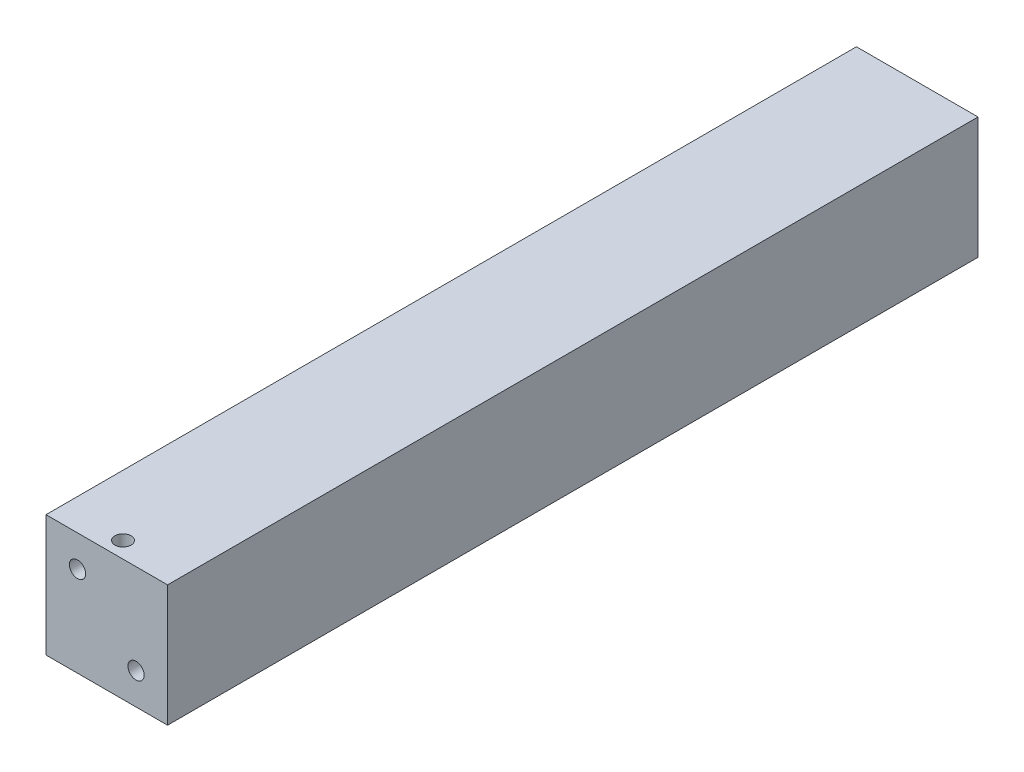
ISO-10303-21;
HEADER;
FILE_DESCRIPTION(('STEP AP214'),'2;1');
FILE_NAME('part.step','',(''),(''),'','','');
FILE_SCHEMA(('AUTOMOTIVE_DESIGN { 1 0 10303 214 1 1 1 1 }'));
ENDSEC;
DATA;
#1=APPLICATION_CONTEXT('core data for automotive mechanical design processes');
#2=APPLICATION_PROTOCOL_DEFINITION('international standard','automotive_design',2000,#1);
#3=PRODUCT_CONTEXT('',#1,'mechanical');
#4=PRODUCT('Part','Part','',(#3));
#5=PRODUCT_RELATED_PRODUCT_CATEGORY('part','',(#4));
#6=PRODUCT_DEFINITION_FORMATION('','',#4);
#7=PRODUCT_DEFINITION_CONTEXT('part definition',#1,'design');
#8=PRODUCT_DEFINITION('design','',#6,#7);
#9=PRODUCT_DEFINITION_SHAPE('','',#8);
#10=(LENGTH_UNIT() NAMED_UNIT(*) SI_UNIT(.MILLI.,.METRE.));
#11=(NAMED_UNIT(*) PLANE_ANGLE_UNIT() SI_UNIT($,.RADIAN.));
#12=(NAMED_UNIT(*) SI_UNIT($,.STERADIAN.) SOLID_ANGLE_UNIT());
#13=UNCERTAINTY_MEASURE_WITH_UNIT(LENGTH_MEASURE(1.E-05),#10,'distance_accuracy_value','');
#14=(GEOMETRIC_REPRESENTATION_CONTEXT(3) GLOBAL_UNCERTAINTY_ASSIGNED_CONTEXT((#13)) GLOBAL_UNIT_ASSIGNED_CONTEXT((#10,
#11,#12)) REPRESENTATION_CONTEXT('',''));
#15=CARTESIAN_POINT('',(0.,0.,0.));
#16=DIRECTION('',(0.,0.,1.));
#17=DIRECTION('',(1.,0.,0.));
#18=AXIS2_PLACEMENT_3D('',#15,#16,#17);
#19=CARTESIAN_POINT('',(15.,-15.,200.));
#20=DIRECTION('',(-1.,0.,0.));
#21=DIRECTION('',(0.,0.,1.));
#22=AXIS2_PLACEMENT_3D('',#19,#20,#21);
#23=PLANE('',#22);
#24=DIRECTION('',(0.,1.,0.));
#25=VECTOR('',#24,1.);
#26=CARTESIAN_POINT('',(15.,-15.,0.));
#27=LINE('',#26,#25);
#28=CARTESIAN_POINT('',(15.,-15.,0.));
#29=VERTEX_POINT('',#28);
#30=CARTESIAN_POINT('',(15.,15.,0.));
#31=VERTEX_POINT('',#30);
#32=EDGE_CURVE('E113',#29,#31,#27,.T.);
#33=ORIENTED_EDGE('',*,*,#32,.T.);
#34=DIRECTION('',(0.,0.,-1.));
#35=VECTOR('',#34,1.);
#36=CARTESIAN_POINT('',(15.,15.,200.));
#37=LINE('',#36,#35);
#38=CARTESIAN_POINT('',(15.,15.,200.));
#39=VERTEX_POINT('',#38);
#40=EDGE_CURVE('E11',#39,#31,#37,.T.);
#41=ORIENTED_EDGE('',*,*,#40,.F.);
#42=DIRECTION('',(0.,1.,0.));
#43=VECTOR('',#42,1.);
#44=CARTESIAN_POINT('',(15.,-15.,200.));
#45=LINE('',#44,#43);
#46=CARTESIAN_POINT('',(15.,-15.,200.));
#47=VERTEX_POINT('',#46);
#48=EDGE_CURVE('E97',#47,#39,#45,.T.);
#49=ORIENTED_EDGE('',*,*,#48,.F.);
#50=DIRECTION('',(0.,0.,-1.));
#51=VECTOR('',#50,1.);
#52=CARTESIAN_POINT('',(15.,-15.,200.));
#53=LINE('',#52,#51);
#54=EDGE_CURVE('E109',#47,#29,#53,.T.);
#55=ORIENTED_EDGE('',*,*,#54,.T.);
#56=EDGE_LOOP('',(#33,#41,#49,#55));
#57=FACE_BOUND('',#56,.T.);
#58=ADVANCED_FACE('F45',(#57),#23,.F.);
#59=CARTESIAN_POINT('',(-15.,15.,200.));
#60=DIRECTION('',(0.,-1.,0.));
#61=DIRECTION('',(0.,0.,-1.));
#62=AXIS2_PLACEMENT_3D('',#59,#60,#61);
#63=PLANE('',#62);
#64=CARTESIAN_POINT('',(0.,15.,196.));
#65=DIRECTION('',(0.,1.,0.));
#66=DIRECTION('',(0.,0.,1.));
#67=AXIS2_PLACEMENT_3D('',#64,#65,#66);
#68=CIRCLE('',#67,2.);
#69=CARTESIAN_POINT('',(0.,15.,198.));
#70=VERTEX_POINT('',#69);
#71=EDGE_CURVE('E150',#70,#70,#68,.T.);
#72=ORIENTED_EDGE('',*,*,#71,.F.);
#73=EDGE_LOOP('',(#72));
#74=FACE_BOUND('',#73,.T.);
#75=DIRECTION('',(-1.,0.,0.));
#76=VECTOR('',#75,1.);
#77=CARTESIAN_POINT('',(-15.,15.,0.));
#78=LINE('',#77,#76);
#79=CARTESIAN_POINT('',(-15.,15.,0.));
#80=VERTEX_POINT('',#79);
#81=EDGE_CURVE('E102',#31,#80,#78,.T.);
#82=ORIENTED_EDGE('',*,*,#81,.T.);
#83=DIRECTION('',(0.,0.,-1.));
#84=VECTOR('',#83,1.);
#85=CARTESIAN_POINT('',(-15.,15.,200.));
#86=LINE('',#85,#84);
#87=CARTESIAN_POINT('',(-15.,15.,200.));
#88=VERTEX_POINT('',#87);
#89=EDGE_CURVE('E54',#88,#80,#86,.T.);
#90=ORIENTED_EDGE('',*,*,#89,.F.);
#91=DIRECTION('',(-1.,0.,0.));
#92=VECTOR('',#91,1.);
#93=CARTESIAN_POINT('',(-15.,15.,200.));
#94=LINE('',#93,#92);
#95=EDGE_CURVE('E92',#39,#88,#94,.T.);
#96=ORIENTED_EDGE('',*,*,#95,.F.);
#97=ORIENTED_EDGE('',*,*,#40,.T.);
#98=EDGE_LOOP('',(#82,#90,#96,#97));
#99=FACE_BOUND('',#98,.T.);
#100=ADVANCED_FACE('F101',(#74,#99),#63,.F.);
#101=CARTESIAN_POINT('',(-15.,-15.,200.));
#102=DIRECTION('',(1.,0.,0.));
#103=DIRECTION('',(0.,0.,-1.));
#104=AXIS2_PLACEMENT_3D('',#101,#102,#103);
#105=PLANE('',#104);
#106=DIRECTION('',(0.,-1.,0.));
#107=VECTOR('',#106,1.);
#108=CARTESIAN_POINT('',(-15.,-15.,0.));
#109=LINE('',#108,#107);
#110=CARTESIAN_POINT('',(-15.,-15.,0.));
#111=VERTEX_POINT('',#110);
#112=EDGE_CURVE('E79',#80,#111,#109,.T.);
#113=ORIENTED_EDGE('',*,*,#112,.T.);
#114=DIRECTION('',(0.,0.,-1.));
#115=VECTOR('',#114,1.);
#116=CARTESIAN_POINT('',(-15.,-15.,200.));
#117=LINE('',#116,#115);
#118=CARTESIAN_POINT('',(-15.,-15.,200.));
#119=VERTEX_POINT('',#118);
#120=EDGE_CURVE('E104',#119,#111,#117,.T.);
#121=ORIENTED_EDGE('',*,*,#120,.F.);
#122=DIRECTION('',(0.,-1.,0.));
#123=VECTOR('',#122,1.);
#124=CARTESIAN_POINT('',(-15.,-15.,200.));
#125=LINE('',#124,#123);
#126=EDGE_CURVE('E95',#88,#119,#125,.T.);
#127=ORIENTED_EDGE('',*,*,#126,.F.);
#128=ORIENTED_EDGE('',*,*,#89,.T.);
#129=EDGE_LOOP('',(#113,#121,#127,#128));
#130=FACE_BOUND('',#129,.T.);
#131=ADVANCED_FACE('F105',(#130),#105,.F.);
#132=CARTESIAN_POINT('',(-15.,-15.,200.));
#133=DIRECTION('',(0.,1.,0.));
#134=DIRECTION('',(0.,0.,1.));
#135=AXIS2_PLACEMENT_3D('',#132,#133,#134);
#136=PLANE('',#135);
#137=CARTESIAN_POINT('',(0.,-15.,196.));
#138=DIRECTION('',(0.,1.,0.));
#139=DIRECTION('',(0.,0.,1.));
#140=AXIS2_PLACEMENT_3D('',#137,#138,#139);
#141=CIRCLE('',#140,2.);
#142=CARTESIAN_POINT('',(0.,-15.,198.));
#143=VERTEX_POINT('',#142);
#144=EDGE_CURVE('E139',#143,#143,#141,.T.);
#145=ORIENTED_EDGE('',*,*,#144,.T.);
#146=EDGE_LOOP('',(#145));
#147=FACE_BOUND('',#146,.T.);
#148=DIRECTION('',(1.,0.,0.));
#149=VECTOR('',#148,1.);
#150=CARTESIAN_POINT('',(-15.,-15.,0.));
#151=LINE('',#150,#149);
#152=EDGE_CURVE('E85',#111,#29,#151,.T.);
#153=ORIENTED_EDGE('',*,*,#152,.T.);
#154=ORIENTED_EDGE('',*,*,#54,.F.);
#155=DIRECTION('',(1.,0.,0.));
#156=VECTOR('',#155,1.);
#157=CARTESIAN_POINT('',(-15.,-15.,200.));
#158=LINE('',#157,#156);
#159=EDGE_CURVE('E62',#119,#47,#158,.T.);
#160=ORIENTED_EDGE('',*,*,#159,.F.);
#161=ORIENTED_EDGE('',*,*,#120,.T.);
#162=EDGE_LOOP('',(#153,#154,#160,#161));
#163=FACE_BOUND('',#162,.T.);
#164=ADVANCED_FACE('F127',(#147,#163),#136,.F.);
#165=CARTESIAN_POINT('',(0.,0.,200.));
#166=DIRECTION('',(0.,0.,-1.));
#167=DIRECTION('',(-1.,0.,0.));
#168=AXIS2_PLACEMENT_3D('',#165,#166,#167);
#169=PLANE('',#168);
#170=CARTESIAN_POINT('',(-7.22182540694798,7.22182540694798,200.));
#171=DIRECTION('',(0.,0.,1.));
#172=DIRECTION('',(1.,0.,0.));
#173=AXIS2_PLACEMENT_3D('',#170,#171,#172);
#174=CIRCLE('',#173,2.);
#175=CARTESIAN_POINT('',(-5.22182540694798,7.22182540694798,200.));
#176=VERTEX_POINT('',#175);
#177=EDGE_CURVE('E143',#176,#176,#174,.T.);
#178=ORIENTED_EDGE('',*,*,#177,.F.);
#179=EDGE_LOOP('',(#178));
#180=FACE_BOUND('',#179,.T.);
#181=CARTESIAN_POINT('',(7.22182540694797,-7.22182540694799,200.));
#182=DIRECTION('',(0.,0.,1.));
#183=DIRECTION('',(-1.,0.,0.));
#184=AXIS2_PLACEMENT_3D('',#181,#182,#183);
#185=CIRCLE('',#184,2.00000000000001);
#186=CARTESIAN_POINT('',(5.22182540694796,-7.22182540694799,200.));
#187=VERTEX_POINT('',#186);
#188=EDGE_CURVE('E138',#187,#187,#185,.T.);
#189=ORIENTED_EDGE('',*,*,#188,.F.);
#190=EDGE_LOOP('',(#189));
#191=FACE_BOUND('',#190,.T.);
#192=ORIENTED_EDGE('',*,*,#48,.T.);
#193=ORIENTED_EDGE('',*,*,#95,.T.);
#194=ORIENTED_EDGE('',*,*,#126,.T.);
#195=ORIENTED_EDGE('',*,*,#159,.T.);
#196=EDGE_LOOP('',(#192,#193,#194,#195));
#197=FACE_BOUND('',#196,.T.);
#198=ADVANCED_FACE('F93',(#180,#191,#197),#169,.F.);
#199=CARTESIAN_POINT('',(0.,0.,0.));
#200=DIRECTION('',(0.,0.,-1.));
#201=DIRECTION('',(-1.,0.,0.));
#202=AXIS2_PLACEMENT_3D('',#199,#200,#201);
#203=PLANE('',#202);
#204=CARTESIAN_POINT('',(0.,0.,0.));
#205=DIRECTION('',(0.,0.,-1.));
#206=DIRECTION('',(-1.,0.,0.));
#207=AXIS2_PLACEMENT_3D('',#204,#205,#206);
#208=CIRCLE('',#207,2.);
#209=CARTESIAN_POINT('',(-2.,0.,0.));
#210=VERTEX_POINT('',#209);
#211=EDGE_CURVE('E158',#210,#210,#208,.T.);
#212=ORIENTED_EDGE('',*,*,#211,.F.);
#213=EDGE_LOOP('',(#212));
#214=FACE_BOUND('',#213,.T.);
#215=ORIENTED_EDGE('',*,*,#32,.F.);
#216=ORIENTED_EDGE('',*,*,#152,.F.);
#217=ORIENTED_EDGE('',*,*,#112,.F.);
#218=ORIENTED_EDGE('',*,*,#81,.F.);
#219=EDGE_LOOP('',(#215,#216,#217,#218));
#220=FACE_BOUND('',#219,.T.);
#221=ADVANCED_FACE('F130',(#214,#220),#203,.T.);
#222=CARTESIAN_POINT('',(7.22182540694797,-7.22182540694799,175.));
#223=DIRECTION('',(0.,0.,1.));
#224=DIRECTION('',(1.,0.,0.));
#225=AXIS2_PLACEMENT_3D('',#222,#223,#224);
#226=CYLINDRICAL_SURFACE('',#225,2.00000000000001);
#227=CARTESIAN_POINT('',(7.22182540694797,-7.22182540694799,175.));
#228=DIRECTION('',(0.,0.,1.));
#229=DIRECTION('',(-1.,0.,0.));
#230=AXIS2_PLACEMENT_3D('',#227,#228,#229);
#231=CIRCLE('',#230,2.00000000000001);
#232=CARTESIAN_POINT('',(5.22182540694796,-7.22182540694799,175.));
#233=VERTEX_POINT('',#232);
#234=EDGE_CURVE('E134',#233,#233,#231,.T.);
#235=ORIENTED_EDGE('',*,*,#234,.F.);
#236=EDGE_LOOP('',(#235));
#237=FACE_BOUND('',#236,.T.);
#238=ORIENTED_EDGE('',*,*,#188,.T.);
#239=EDGE_LOOP('',(#238));
#240=FACE_BOUND('',#239,.T.);
#241=ADVANCED_FACE('F176',(#237,#240),#226,.F.);
#242=CARTESIAN_POINT('',(7.22182540694797,-7.22182540694799,175.));
#243=DIRECTION('',(0.,0.,-1.));
#244=DIRECTION('',(-1.,0.,0.));
#245=AXIS2_PLACEMENT_3D('',#242,#243,#244);
#246=PLANE('',#245);
#247=ORIENTED_EDGE('',*,*,#234,.T.);
#248=EDGE_LOOP('',(#247));
#249=FACE_BOUND('',#248,.T.);
#250=ADVANCED_FACE('F182',(#249),#246,.F.);
#251=CARTESIAN_POINT('',(-7.22182540694798,7.22182540694798,175.));
#252=DIRECTION('',(0.,0.,1.));
#253=DIRECTION('',(1.,0.,0.));
#254=AXIS2_PLACEMENT_3D('',#251,#252,#253);
#255=CYLINDRICAL_SURFACE('',#254,2.);
#256=CARTESIAN_POINT('',(-7.22182540694798,7.22182540694798,175.));
#257=DIRECTION('',(0.,0.,1.));
#258=DIRECTION('',(1.,0.,0.));
#259=AXIS2_PLACEMENT_3D('',#256,#257,#258);
#260=CIRCLE('',#259,2.);
#261=CARTESIAN_POINT('',(-5.22182540694798,7.22182540694798,175.));
#262=VERTEX_POINT('',#261);
#263=EDGE_CURVE('E117',#262,#262,#260,.T.);
#264=ORIENTED_EDGE('',*,*,#263,.F.);
#265=EDGE_LOOP('',(#264));
#266=FACE_BOUND('',#265,.T.);
#267=ORIENTED_EDGE('',*,*,#177,.T.);
#268=EDGE_LOOP('',(#267));
#269=FACE_BOUND('',#268,.T.);
#270=ADVANCED_FACE('F211',(#266,#269),#255,.F.);
#271=CARTESIAN_POINT('',(-7.22182540694798,7.22182540694798,175.));
#272=DIRECTION('',(0.,0.,1.));
#273=DIRECTION('',(1.,0.,0.));
#274=AXIS2_PLACEMENT_3D('',#271,#272,#273);
#275=PLANE('',#274);
#276=ORIENTED_EDGE('',*,*,#263,.T.);
#277=EDGE_LOOP('',(#276));
#278=FACE_BOUND('',#277,.T.);
#279=ADVANCED_FACE('F207',(#278),#275,.T.);
#280=CARTESIAN_POINT('',(0.,-15.,196.));
#281=DIRECTION('',(0.,1.,0.));
#282=DIRECTION('',(0.,0.,1.));
#283=AXIS2_PLACEMENT_3D('',#280,#281,#282);
#284=CYLINDRICAL_SURFACE('',#283,2.);
#285=ORIENTED_EDGE('',*,*,#144,.F.);
#286=EDGE_LOOP('',(#285));
#287=FACE_BOUND('',#286,.T.);
#288=ORIENTED_EDGE('',*,*,#71,.T.);
#289=EDGE_LOOP('',(#288));
#290=FACE_BOUND('',#289,.T.);
#291=ADVANCED_FACE('F171',(#287,#290),#284,.F.);
#292=CARTESIAN_POINT('',(0.,0.,25.));
#293=DIRECTION('',(0.,0.,-1.));
#294=DIRECTION('',(-1.,0.,0.));
#295=AXIS2_PLACEMENT_3D('',#292,#293,#294);
#296=CYLINDRICAL_SURFACE('',#295,2.);
#297=CARTESIAN_POINT('',(0.,0.,25.));
#298=DIRECTION('',(0.,0.,-1.));
#299=DIRECTION('',(-1.,0.,0.));
#300=AXIS2_PLACEMENT_3D('',#297,#298,#299);
#301=CIRCLE('',#300,2.);
#302=CARTESIAN_POINT('',(-2.,0.,25.));
#303=VERTEX_POINT('',#302);
#304=EDGE_CURVE('E154',#303,#303,#301,.T.);
#305=ORIENTED_EDGE('',*,*,#304,.F.);
#306=EDGE_LOOP('',(#305));
#307=FACE_BOUND('',#306,.T.);
#308=ORIENTED_EDGE('',*,*,#211,.T.);
#309=EDGE_LOOP('',(#308));
#310=FACE_BOUND('',#309,.T.);
#311=ADVANCED_FACE('F168',(#307,#310),#296,.F.);
#312=CARTESIAN_POINT('',(0.,0.,25.));
#313=DIRECTION('',(0.,0.,-1.));
#314=DIRECTION('',(-1.,0.,0.));
#315=AXIS2_PLACEMENT_3D('',#312,#313,#314);
#316=PLANE('',#315);
#317=ORIENTED_EDGE('',*,*,#304,.T.);
#318=EDGE_LOOP('',(#317));
#319=FACE_BOUND('',#318,.T.);
#320=ADVANCED_FACE('F166',(#319),#316,.T.);
#321=CLOSED_SHELL('',(#58,#100,#131,#164,#198,#221,#241,#250,#270,#279,#291,#311,#320));
#322=MANIFOLD_SOLID_BREP('B2',#321);
#323=ADVANCED_BREP_SHAPE_REPRESENTATION('',(#18,#322),#14);
#324=SHAPE_DEFINITION_REPRESENTATION(#9,#323);
ENDSEC;
END-ISO-10303-21;
